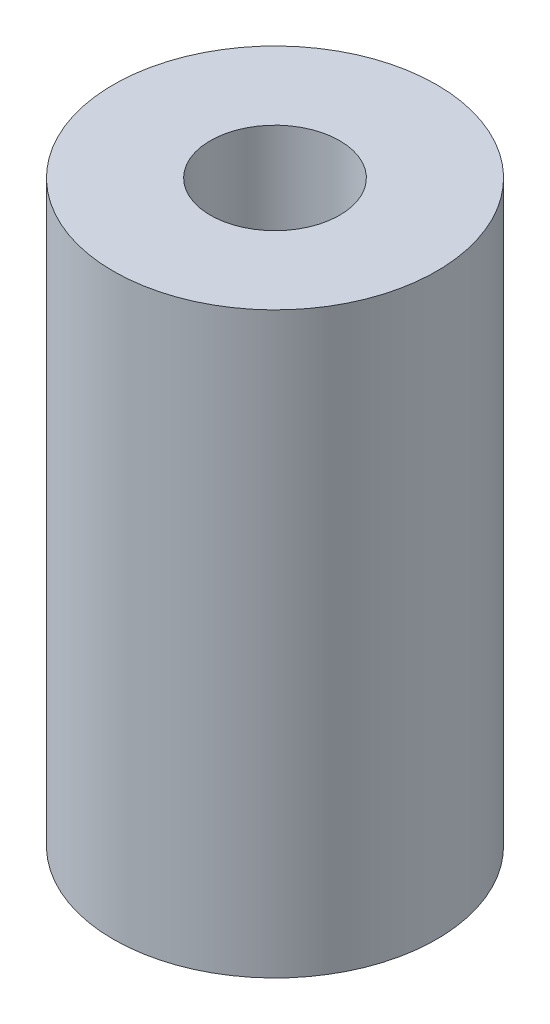
ISO-10303-21;
HEADER;
FILE_DESCRIPTION(('STEP AP214'),'2;1');
FILE_NAME('part.step','',(''),(''),'','','');
FILE_SCHEMA(('AUTOMOTIVE_DESIGN { 1 0 10303 214 1 1 1 1 }'));
ENDSEC;
DATA;
#1=APPLICATION_CONTEXT('core data for automotive mechanical design processes');
#2=APPLICATION_PROTOCOL_DEFINITION('international standard','automotive_design',2000,#1);
#3=PRODUCT_CONTEXT('',#1,'mechanical');
#4=PRODUCT('Part','Part','',(#3));
#5=PRODUCT_RELATED_PRODUCT_CATEGORY('part','',(#4));
#6=PRODUCT_DEFINITION_FORMATION('','',#4);
#7=PRODUCT_DEFINITION_CONTEXT('part definition',#1,'design');
#8=PRODUCT_DEFINITION('design','',#6,#7);
#9=PRODUCT_DEFINITION_SHAPE('','',#8);
#10=(LENGTH_UNIT() NAMED_UNIT(*) SI_UNIT(.MILLI.,.METRE.));
#11=(NAMED_UNIT(*) PLANE_ANGLE_UNIT() SI_UNIT($,.RADIAN.));
#12=(NAMED_UNIT(*) SI_UNIT($,.STERADIAN.) SOLID_ANGLE_UNIT());
#13=UNCERTAINTY_MEASURE_WITH_UNIT(LENGTH_MEASURE(1.E-05),#10,'distance_accuracy_value','');
#14=(GEOMETRIC_REPRESENTATION_CONTEXT(3) GLOBAL_UNCERTAINTY_ASSIGNED_CONTEXT((#13)) GLOBAL_UNIT_ASSIGNED_CONTEXT((#10,
#11,#12)) REPRESENTATION_CONTEXT('',''));
#15=CARTESIAN_POINT('',(0.,0.,0.));
#16=DIRECTION('',(0.,0.,1.));
#17=DIRECTION('',(1.,0.,0.));
#18=AXIS2_PLACEMENT_3D('',#15,#16,#17);
#19=CARTESIAN_POINT('',(0.,17.9,0.));
#20=DIRECTION('',(0.,1.,0.));
#21=DIRECTION('',(0.,0.,1.));
#22=AXIS2_PLACEMENT_3D('',#19,#20,#21);
#23=PLANE('',#22);
#24=CARTESIAN_POINT('',(0.,17.9,0.));
#25=DIRECTION('',(0.,1.,0.));
#26=DIRECTION('',(0.,0.,1.));
#27=AXIS2_PLACEMENT_3D('',#24,#25,#26);
#28=CIRCLE('',#27,5.);
#29=CARTESIAN_POINT('',(0.,17.9,-5.));
#30=VERTEX_POINT('',#29);
#31=EDGE_CURVE('E10',#30,#30,#28,.T.);
#32=ORIENTED_EDGE('',*,*,#31,.T.);
#33=EDGE_LOOP('',(#32));
#34=FACE_BOUND('',#33,.T.);
#35=CARTESIAN_POINT('',(0.,17.9,0.));
#36=DIRECTION('',(0.,1.,0.));
#37=DIRECTION('',(0.,0.,1.));
#38=AXIS2_PLACEMENT_3D('',#35,#36,#37);
#39=CIRCLE('',#38,2.);
#40=CARTESIAN_POINT('',(0.,17.9,-2.));
#41=VERTEX_POINT('',#40);
#42=EDGE_CURVE('E42',#41,#41,#39,.T.);
#43=ORIENTED_EDGE('',*,*,#42,.F.);
#44=EDGE_LOOP('',(#43));
#45=FACE_BOUND('',#44,.T.);
#46=ADVANCED_FACE('F31',(#34,#45),#23,.T.);
#47=CARTESIAN_POINT('',(0.,0.,0.));
#48=DIRECTION('',(0.,1.,0.));
#49=DIRECTION('',(0.,0.,1.));
#50=AXIS2_PLACEMENT_3D('',#47,#48,#49);
#51=PLANE('',#50);
#52=CARTESIAN_POINT('',(0.,0.,0.));
#53=DIRECTION('',(0.,1.,0.));
#54=DIRECTION('',(0.,0.,1.));
#55=AXIS2_PLACEMENT_3D('',#52,#53,#54);
#56=CIRCLE('',#55,5.);
#57=CARTESIAN_POINT('',(0.,0.,-5.));
#58=VERTEX_POINT('',#57);
#59=EDGE_CURVE('E35',#58,#58,#56,.T.);
#60=ORIENTED_EDGE('',*,*,#59,.F.);
#61=EDGE_LOOP('',(#60));
#62=FACE_BOUND('',#61,.T.);
#63=CARTESIAN_POINT('',(0.,0.,0.));
#64=DIRECTION('',(0.,1.,0.));
#65=DIRECTION('',(0.,0.,1.));
#66=AXIS2_PLACEMENT_3D('',#63,#64,#65);
#67=CIRCLE('',#66,2.);
#68=CARTESIAN_POINT('',(0.,0.,-2.));
#69=VERTEX_POINT('',#68);
#70=EDGE_CURVE('E44',#69,#69,#67,.T.);
#71=ORIENTED_EDGE('',*,*,#70,.T.);
#72=EDGE_LOOP('',(#71));
#73=FACE_BOUND('',#72,.T.);
#74=ADVANCED_FACE('F54',(#62,#73),#51,.F.);
#75=CARTESIAN_POINT('',(0.,17.9,0.));
#76=DIRECTION('',(0.,-1.,0.));
#77=DIRECTION('',(0.,0.,-1.));
#78=AXIS2_PLACEMENT_3D('',#75,#76,#77);
#79=CYLINDRICAL_SURFACE('',#78,5.);
#80=CARTESIAN_POINT('',(0.,17.9,-5.));
#81=CARTESIAN_POINT('',(0.,17.7135416666667,-5.));
#82=CARTESIAN_POINT('',(0.,17.5270833333333,-5.));
#83=CARTESIAN_POINT('',(0.,17.1541666666667,-5.));
#84=CARTESIAN_POINT('',(0.,16.9677083333333,-5.));
#85=CARTESIAN_POINT('',(0.,16.5947916666667,-5.));
#86=CARTESIAN_POINT('',(0.,16.4083333333333,-5.));
#87=CARTESIAN_POINT('',(0.,16.0354166666667,-5.));
#88=CARTESIAN_POINT('',(0.,15.8489583333333,-5.));
#89=CARTESIAN_POINT('',(0.,15.4760416666667,-5.));
#90=CARTESIAN_POINT('',(0.,15.2895833333333,-5.));
#91=CARTESIAN_POINT('',(0.,14.9166666666667,-5.));
#92=CARTESIAN_POINT('',(0.,14.7302083333333,-5.));
#93=CARTESIAN_POINT('',(0.,14.3572916666667,-5.));
#94=CARTESIAN_POINT('',(0.,14.1708333333333,-5.));
#95=CARTESIAN_POINT('',(0.,13.7979166666667,-5.));
#96=CARTESIAN_POINT('',(0.,13.6114583333333,-5.));
#97=CARTESIAN_POINT('',(0.,13.2385416666667,-5.));
#98=CARTESIAN_POINT('',(0.,13.0520833333333,-5.));
#99=CARTESIAN_POINT('',(0.,12.6791666666667,-5.));
#100=CARTESIAN_POINT('',(0.,12.4927083333333,-5.));
#101=CARTESIAN_POINT('',(0.,12.1197916666667,-5.));
#102=CARTESIAN_POINT('',(0.,11.9333333333333,-5.));
#103=CARTESIAN_POINT('',(0.,11.5604166666667,-5.));
#104=CARTESIAN_POINT('',(0.,11.3739583333333,-5.));
#105=CARTESIAN_POINT('',(0.,11.0010416666667,-5.));
#106=CARTESIAN_POINT('',(0.,10.8145833333333,-5.));
#107=CARTESIAN_POINT('',(0.,10.4416666666667,-5.));
#108=CARTESIAN_POINT('',(0.,10.2552083333333,-5.));
#109=CARTESIAN_POINT('',(0.,9.88229166666666,-5.));
#110=CARTESIAN_POINT('',(0.,9.69583333333333,-5.));
#111=CARTESIAN_POINT('',(0.,9.32291666666666,-5.));
#112=CARTESIAN_POINT('',(0.,9.13645833333333,-5.));
#113=CARTESIAN_POINT('',(0.,8.76354166666667,-5.));
#114=CARTESIAN_POINT('',(0.,8.57708333333333,-5.));
#115=CARTESIAN_POINT('',(0.,8.20416666666666,-5.));
#116=CARTESIAN_POINT('',(0.,8.01770833333333,-5.));
#117=CARTESIAN_POINT('',(0.,7.64479166666666,-5.));
#118=CARTESIAN_POINT('',(0.,7.45833333333333,-5.));
#119=CARTESIAN_POINT('',(0.,7.08541666666666,-5.));
#120=CARTESIAN_POINT('',(0.,6.89895833333333,-5.));
#121=CARTESIAN_POINT('',(0.,6.52604166666666,-5.));
#122=CARTESIAN_POINT('',(0.,6.33958333333333,-5.));
#123=CARTESIAN_POINT('',(0.,5.96666666666666,-5.));
#124=CARTESIAN_POINT('',(0.,5.78020833333333,-5.));
#125=CARTESIAN_POINT('',(0.,5.40729166666666,-5.));
#126=CARTESIAN_POINT('',(0.,5.22083333333333,-5.));
#127=CARTESIAN_POINT('',(0.,4.84791666666666,-5.));
#128=CARTESIAN_POINT('',(0.,4.66145833333333,-5.));
#129=CARTESIAN_POINT('',(0.,4.28854166666666,-5.));
#130=CARTESIAN_POINT('',(0.,4.10208333333333,-5.));
#131=CARTESIAN_POINT('',(0.,3.72916666666666,-5.));
#132=CARTESIAN_POINT('',(0.,3.54270833333333,-5.));
#133=CARTESIAN_POINT('',(0.,3.16979166666666,-5.));
#134=CARTESIAN_POINT('',(0.,2.98333333333333,-5.));
#135=CARTESIAN_POINT('',(0.,2.61041666666666,-5.));
#136=CARTESIAN_POINT('',(0.,2.42395833333333,-5.));
#137=CARTESIAN_POINT('',(0.,2.05104166666666,-5.));
#138=CARTESIAN_POINT('',(0.,1.86458333333333,-5.));
#139=CARTESIAN_POINT('',(0.,1.49166666666666,-5.));
#140=CARTESIAN_POINT('',(0.,1.30520833333333,-5.));
#141=CARTESIAN_POINT('',(0.,0.932291666666665,-5.));
#142=CARTESIAN_POINT('',(0.,0.745833333333331,-5.));
#143=CARTESIAN_POINT('',(0.,0.372916666666664,-5.));
#144=CARTESIAN_POINT('',(0.,0.18645833333333,-5.));
#145=CARTESIAN_POINT('',(0.,0.,-5.));
#146=B_SPLINE_CURVE_WITH_KNOTS('',3,(#80,#81,#82,#83,#84,#85,#86,#87,#88,#89,#90,#91,#92,#93,
#94,#95,#96,#97,#98,#99,#100,#101,#102,#103,#104,#105,#106,#107,#108,#109,#110,#111,#112,#113,
#114,#115,#116,#117,#118,#119,#120,#121,#122,#123,#124,#125,#126,#127,#128,#129,#130,#131,#132,
#133,#134,#135,#136,#137,#138,#139,#140,#141,#142,#143,#144,#145),.UNSPECIFIED.,.F.,.F.,(4,2,2,
2,2,2,2,2,2,2,2,2,2,2,2,2,2,2,2,2,2,2,2,2,2,2,2,2,2,2,2,2,4),(0.,0.559374999999997,1.11875,
1.678125,2.2375,2.796875,3.35625,3.915625,4.475,5.034375,5.59375,6.153125,6.7125,7.271875,
7.83125,8.390625,8.95,9.509375,10.06875,10.628125,11.1875,11.746875,12.30625,12.865625,13.425,
13.984375,14.54375,15.103125,15.6625,16.221875,16.78125,17.340625,17.9),.UNSPECIFIED.);
#147=EDGE_CURVE('BSEAM33',#30,#58,#146,.T.);
#148=ORIENTED_EDGE('',*,*,#31,.F.);
#149=ORIENTED_EDGE('',*,*,#59,.T.);
#150=ORIENTED_EDGE('',*,*,#147,.T.);
#151=ORIENTED_EDGE('',*,*,#147,.F.);
#152=EDGE_LOOP('',(#148,#150,#149,#151));
#153=FACE_BOUND('',#152,.T.);
#154=ADVANCED_FACE('F33',(#153),#79,.T.);
#155=CARTESIAN_POINT('',(0.,17.9,0.));
#156=DIRECTION('',(0.,-1.,0.));
#157=DIRECTION('',(0.,0.,-1.));
#158=AXIS2_PLACEMENT_3D('',#155,#156,#157);
#159=CYLINDRICAL_SURFACE('',#158,2.);
#160=CARTESIAN_POINT('',(0.,17.9,-2.));
#161=CARTESIAN_POINT('',(0.,17.7135416666667,-2.));
#162=CARTESIAN_POINT('',(0.,17.5270833333333,-2.));
#163=CARTESIAN_POINT('',(0.,17.1541666666667,-2.));
#164=CARTESIAN_POINT('',(0.,16.9677083333333,-2.));
#165=CARTESIAN_POINT('',(0.,16.5947916666667,-2.));
#166=CARTESIAN_POINT('',(0.,16.4083333333333,-2.));
#167=CARTESIAN_POINT('',(0.,16.0354166666667,-2.));
#168=CARTESIAN_POINT('',(0.,15.8489583333333,-2.));
#169=CARTESIAN_POINT('',(0.,15.4760416666667,-2.));
#170=CARTESIAN_POINT('',(0.,15.2895833333333,-2.));
#171=CARTESIAN_POINT('',(0.,14.9166666666667,-2.));
#172=CARTESIAN_POINT('',(0.,14.7302083333333,-2.));
#173=CARTESIAN_POINT('',(0.,14.3572916666667,-2.));
#174=CARTESIAN_POINT('',(0.,14.1708333333333,-2.));
#175=CARTESIAN_POINT('',(0.,13.7979166666667,-2.));
#176=CARTESIAN_POINT('',(0.,13.6114583333333,-2.));
#177=CARTESIAN_POINT('',(0.,13.2385416666667,-2.));
#178=CARTESIAN_POINT('',(0.,13.0520833333333,-2.));
#179=CARTESIAN_POINT('',(0.,12.6791666666667,-2.));
#180=CARTESIAN_POINT('',(0.,12.4927083333333,-2.));
#181=CARTESIAN_POINT('',(0.,12.1197916666667,-2.));
#182=CARTESIAN_POINT('',(0.,11.9333333333333,-2.));
#183=CARTESIAN_POINT('',(0.,11.5604166666667,-2.));
#184=CARTESIAN_POINT('',(0.,11.3739583333333,-2.));
#185=CARTESIAN_POINT('',(0.,11.0010416666667,-2.));
#186=CARTESIAN_POINT('',(0.,10.8145833333333,-2.));
#187=CARTESIAN_POINT('',(0.,10.4416666666667,-2.));
#188=CARTESIAN_POINT('',(0.,10.2552083333333,-2.));
#189=CARTESIAN_POINT('',(0.,9.88229166666666,-2.));
#190=CARTESIAN_POINT('',(0.,9.69583333333333,-2.));
#191=CARTESIAN_POINT('',(0.,9.32291666666666,-2.));
#192=CARTESIAN_POINT('',(0.,9.13645833333333,-2.));
#193=CARTESIAN_POINT('',(0.,8.76354166666667,-2.));
#194=CARTESIAN_POINT('',(0.,8.57708333333333,-2.));
#195=CARTESIAN_POINT('',(0.,8.20416666666666,-2.));
#196=CARTESIAN_POINT('',(0.,8.01770833333333,-2.));
#197=CARTESIAN_POINT('',(0.,7.64479166666666,-2.));
#198=CARTESIAN_POINT('',(0.,7.45833333333333,-2.));
#199=CARTESIAN_POINT('',(0.,7.08541666666666,-2.));
#200=CARTESIAN_POINT('',(0.,6.89895833333333,-2.));
#201=CARTESIAN_POINT('',(0.,6.52604166666666,-2.));
#202=CARTESIAN_POINT('',(0.,6.33958333333333,-2.));
#203=CARTESIAN_POINT('',(0.,5.96666666666666,-2.));
#204=CARTESIAN_POINT('',(0.,5.78020833333333,-2.));
#205=CARTESIAN_POINT('',(0.,5.40729166666666,-2.));
#206=CARTESIAN_POINT('',(0.,5.22083333333333,-2.));
#207=CARTESIAN_POINT('',(0.,4.84791666666666,-2.));
#208=CARTESIAN_POINT('',(0.,4.66145833333333,-2.));
#209=CARTESIAN_POINT('',(0.,4.28854166666666,-2.));
#210=CARTESIAN_POINT('',(0.,4.10208333333333,-2.));
#211=CARTESIAN_POINT('',(0.,3.72916666666666,-2.));
#212=CARTESIAN_POINT('',(0.,3.54270833333333,-2.));
#213=CARTESIAN_POINT('',(0.,3.16979166666666,-2.));
#214=CARTESIAN_POINT('',(0.,2.98333333333333,-2.));
#215=CARTESIAN_POINT('',(0.,2.61041666666666,-2.));
#216=CARTESIAN_POINT('',(0.,2.42395833333333,-2.));
#217=CARTESIAN_POINT('',(0.,2.05104166666666,-2.));
#218=CARTESIAN_POINT('',(0.,1.86458333333333,-2.));
#219=CARTESIAN_POINT('',(0.,1.49166666666666,-2.));
#220=CARTESIAN_POINT('',(0.,1.30520833333333,-2.));
#221=CARTESIAN_POINT('',(0.,0.932291666666665,-2.));
#222=CARTESIAN_POINT('',(0.,0.745833333333331,-2.));
#223=CARTESIAN_POINT('',(0.,0.372916666666664,-2.));
#224=CARTESIAN_POINT('',(0.,0.18645833333333,-2.));
#225=CARTESIAN_POINT('',(0.,0.,-2.));
#226=B_SPLINE_CURVE_WITH_KNOTS('',3,(#160,#161,#162,#163,#164,#165,#166,#167,#168,#169,#170,
#171,#172,#173,#174,#175,#176,#177,#178,#179,#180,#181,#182,#183,#184,#185,#186,#187,#188,#189,
#190,#191,#192,#193,#194,#195,#196,#197,#198,#199,#200,#201,#202,#203,#204,#205,#206,#207,#208,
#209,#210,#211,#212,#213,#214,#215,#216,#217,#218,#219,#220,#221,#222,#223,#224,#225),
.UNSPECIFIED.,.F.,.F.,(4,2,2,2,2,2,2,2,2,2,2,2,2,2,2,2,2,2,2,2,2,2,2,2,2,2,2,2,2,2,2,2,4),(0.,
0.559374999999997,1.11875,1.678125,2.2375,2.796875,3.35625,3.915625,4.475,5.034375,5.59375,
6.153125,6.7125,7.271875,7.83125,8.390625,8.95,9.509375,10.06875,10.628125,11.1875,11.746875,
12.30625,12.865625,13.425,13.984375,14.54375,15.103125,15.6625,16.221875,16.78125,17.340625,
17.9),.UNSPECIFIED.);
#227=EDGE_CURVE('BSEAM50',#41,#69,#226,.T.);
#228=ORIENTED_EDGE('',*,*,#42,.T.);
#229=ORIENTED_EDGE('',*,*,#70,.F.);
#230=ORIENTED_EDGE('',*,*,#227,.T.);
#231=ORIENTED_EDGE('',*,*,#227,.F.);
#232=EDGE_LOOP('',(#228,#230,#229,#231));
#233=FACE_BOUND('',#232,.T.);
#234=ADVANCED_FACE('F50',(#233),#159,.F.);
#235=CLOSED_SHELL('',(#46,#74,#154,#234));
#236=MANIFOLD_SOLID_BREP('B2',#235);
#237=ADVANCED_BREP_SHAPE_REPRESENTATION('',(#18,#236),#14);
#238=SHAPE_DEFINITION_REPRESENTATION(#9,#237);
ENDSEC;
END-ISO-10303-21;
